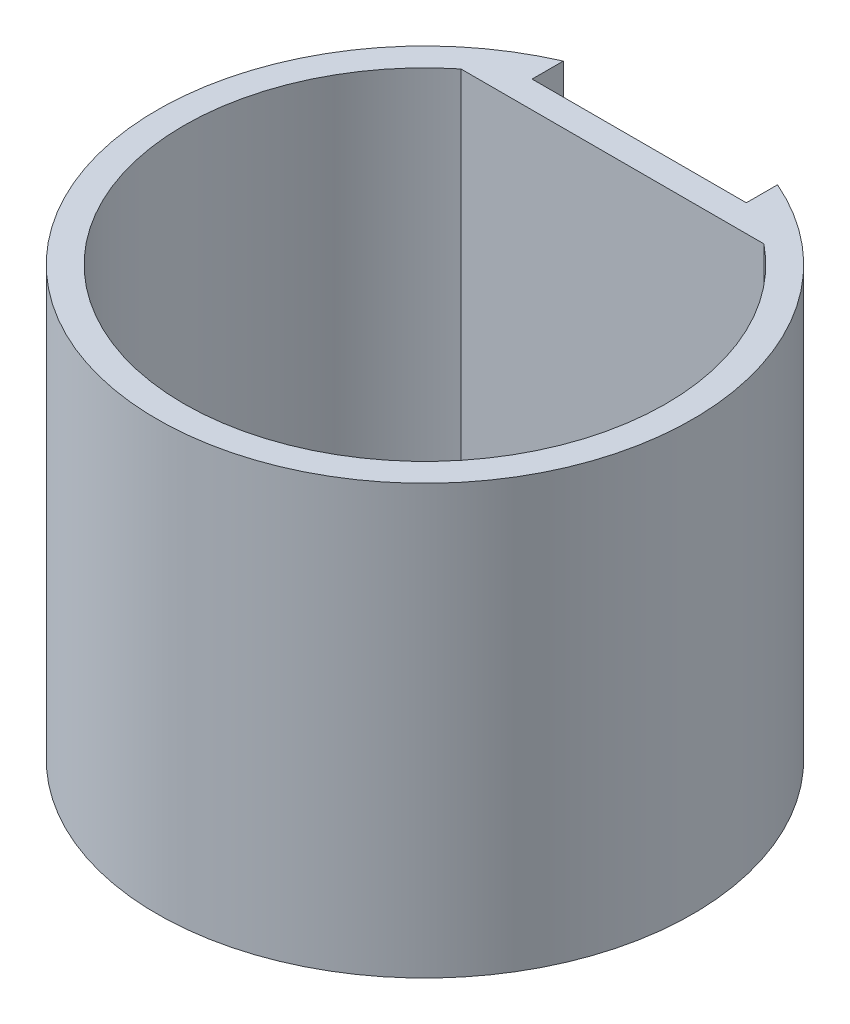
ISO-10303-21;
HEADER;
FILE_DESCRIPTION(('STEP AP214'),'2;1');
FILE_NAME('part.step','',(''),(''),'','','');
FILE_SCHEMA(('AUTOMOTIVE_DESIGN { 1 0 10303 214 1 1 1 1 }'));
ENDSEC;
DATA;
#1=APPLICATION_CONTEXT('core data for automotive mechanical design processes');
#2=APPLICATION_PROTOCOL_DEFINITION('international standard','automotive_design',2000,#1);
#3=PRODUCT_CONTEXT('',#1,'mechanical');
#4=PRODUCT('Part','Part','',(#3));
#5=PRODUCT_RELATED_PRODUCT_CATEGORY('part','',(#4));
#6=PRODUCT_DEFINITION_FORMATION('','',#4);
#7=PRODUCT_DEFINITION_CONTEXT('part definition',#1,'design');
#8=PRODUCT_DEFINITION('design','',#6,#7);
#9=PRODUCT_DEFINITION_SHAPE('','',#8);
#10=(LENGTH_UNIT() NAMED_UNIT(*) SI_UNIT(.MILLI.,.METRE.));
#11=(NAMED_UNIT(*) PLANE_ANGLE_UNIT() SI_UNIT($,.RADIAN.));
#12=(NAMED_UNIT(*) SI_UNIT($,.STERADIAN.) SOLID_ANGLE_UNIT());
#13=UNCERTAINTY_MEASURE_WITH_UNIT(LENGTH_MEASURE(1.E-05),#10,'distance_accuracy_value','');
#14=(GEOMETRIC_REPRESENTATION_CONTEXT(3) GLOBAL_UNCERTAINTY_ASSIGNED_CONTEXT((#13)) GLOBAL_UNIT_ASSIGNED_CONTEXT((#10,
#11,#12)) REPRESENTATION_CONTEXT('',''));
#15=CARTESIAN_POINT('',(0.,0.,0.));
#16=DIRECTION('',(0.,0.,1.));
#17=DIRECTION('',(1.,0.,0.));
#18=AXIS2_PLACEMENT_3D('',#15,#16,#17);
#19=CARTESIAN_POINT('',(0.,0.,0.));
#20=DIRECTION('',(0.,1.,0.));
#21=DIRECTION('',(0.,0.,1.));
#22=AXIS2_PLACEMENT_3D('',#19,#20,#21);
#23=PLANE('',#22);
#24=CARTESIAN_POINT('',(0.,0.,0.));
#25=DIRECTION('',(0.,1.,0.));
#26=DIRECTION('',(0.,0.,1.));
#27=AXIS2_PLACEMENT_3D('',#24,#25,#26);
#28=CIRCLE('',#27,100.);
#29=CARTESIAN_POINT('',(-40.,0.,-91.6515138991168));
#30=VERTEX_POINT('',#29);
#31=CARTESIAN_POINT('',(40.,0.,-91.6515138991168));
#32=VERTEX_POINT('',#31);
#33=EDGE_CURVE('E126',#30,#32,#28,.T.);
#34=ORIENTED_EDGE('',*,*,#33,.T.);
#35=DIRECTION('',(0.,0.,-1.));
#36=VECTOR('',#35,1.);
#37=CARTESIAN_POINT('',(40.,0.,-80.));
#38=LINE('',#37,#36);
#39=CARTESIAN_POINT('',(40.,0.,-80.));
#40=VERTEX_POINT('',#39);
#41=EDGE_CURVE('E143',#40,#32,#38,.T.);
#42=ORIENTED_EDGE('',*,*,#41,.F.);
#43=DIRECTION('',(1.,0.,0.));
#44=VECTOR('',#43,1.);
#45=CARTESIAN_POINT('',(-40.,0.,-80.));
#46=LINE('',#45,#44);
#47=CARTESIAN_POINT('',(-40.,0.,-80.));
#48=VERTEX_POINT('',#47);
#49=EDGE_CURVE('E147',#48,#40,#46,.T.);
#50=ORIENTED_EDGE('',*,*,#49,.F.);
#51=DIRECTION('',(0.,0.,1.));
#52=VECTOR('',#51,1.);
#53=CARTESIAN_POINT('',(-40.,0.,-91.6515138991168));
#54=LINE('',#53,#52);
#55=EDGE_CURVE('E131',#30,#48,#54,.T.);
#56=ORIENTED_EDGE('',*,*,#55,.F.);
#57=EDGE_LOOP('',(#34,#42,#50,#56));
#58=FACE_BOUND('',#57,.T.);
#59=CARTESIAN_POINT('',(0.,0.,0.));
#60=DIRECTION('',(0.,1.,0.));
#61=DIRECTION('',(0.,0.,1.));
#62=AXIS2_PLACEMENT_3D('',#59,#60,#61);
#63=CIRCLE('',#62,90.);
#64=CARTESIAN_POINT('',(-56.5685424949238,0.,-70.));
#65=VERTEX_POINT('',#64);
#66=CARTESIAN_POINT('',(56.5685424949238,0.,-70.));
#67=VERTEX_POINT('',#66);
#68=EDGE_CURVE('E115',#65,#67,#63,.T.);
#69=ORIENTED_EDGE('',*,*,#68,.F.);
#70=DIRECTION('',(1.,0.,0.));
#71=VECTOR('',#70,1.);
#72=CARTESIAN_POINT('',(0.,0.,-70.));
#73=LINE('',#72,#71);
#74=EDGE_CURVE('E57',#65,#67,#73,.T.);
#75=ORIENTED_EDGE('',*,*,#74,.T.);
#76=EDGE_LOOP('',(#69,#75));
#77=FACE_BOUND('',#76,.T.);
#78=ADVANCED_FACE('F39',(#58,#77),#23,.T.);
#79=CARTESIAN_POINT('',(0.,-160.,0.));
#80=DIRECTION('',(0.,1.,0.));
#81=DIRECTION('',(0.,0.,1.));
#82=AXIS2_PLACEMENT_3D('',#79,#80,#81);
#83=CYLINDRICAL_SURFACE('',#82,100.);
#84=ORIENTED_EDGE('',*,*,#33,.F.);
#85=DIRECTION('',(0.,1.,0.));
#86=VECTOR('',#85,1.);
#87=CARTESIAN_POINT('',(-40.,-160.,-91.6515138991168));
#88=LINE('',#87,#86);
#89=CARTESIAN_POINT('',(-40.,-160.,-91.6515138991168));
#90=VERTEX_POINT('',#89);
#91=EDGE_CURVE('E11',#90,#30,#88,.T.);
#92=ORIENTED_EDGE('',*,*,#91,.F.);
#93=CARTESIAN_POINT('',(0.,-160.,0.));
#94=DIRECTION('',(0.,1.,0.));
#95=DIRECTION('',(0.,0.,1.));
#96=AXIS2_PLACEMENT_3D('',#93,#94,#95);
#97=CIRCLE('',#96,100.);
#98=CARTESIAN_POINT('',(40.,-160.,-91.6515138991168));
#99=VERTEX_POINT('',#98);
#100=EDGE_CURVE('E128',#90,#99,#97,.T.);
#101=ORIENTED_EDGE('',*,*,#100,.T.);
#102=DIRECTION('',(0.,1.,0.));
#103=VECTOR('',#102,1.);
#104=CARTESIAN_POINT('',(40.,-160.,-91.6515138991168));
#105=LINE('',#104,#103);
#106=EDGE_CURVE('E43',#99,#32,#105,.T.);
#107=ORIENTED_EDGE('',*,*,#106,.T.);
#108=EDGE_LOOP('',(#84,#92,#101,#107));
#109=FACE_BOUND('',#108,.T.);
#110=ADVANCED_FACE('F41',(#109),#83,.T.);
#111=CARTESIAN_POINT('',(-40.,-160.,-91.6515138991168));
#112=DIRECTION('',(-1.,0.,0.));
#113=DIRECTION('',(0.,0.,1.));
#114=AXIS2_PLACEMENT_3D('',#111,#112,#113);
#115=PLANE('',#114);
#116=ORIENTED_EDGE('',*,*,#55,.T.);
#117=DIRECTION('',(0.,1.,0.));
#118=VECTOR('',#117,1.);
#119=CARTESIAN_POINT('',(-40.,-160.,-80.));
#120=LINE('',#119,#118);
#121=CARTESIAN_POINT('',(-40.,-160.,-80.));
#122=VERTEX_POINT('',#121);
#123=EDGE_CURVE('E49',#122,#48,#120,.T.);
#124=ORIENTED_EDGE('',*,*,#123,.F.);
#125=DIRECTION('',(0.,0.,1.));
#126=VECTOR('',#125,1.);
#127=CARTESIAN_POINT('',(-40.,-160.,-91.6515138991168));
#128=LINE('',#127,#126);
#129=EDGE_CURVE('E137',#90,#122,#128,.T.);
#130=ORIENTED_EDGE('',*,*,#129,.F.);
#131=ORIENTED_EDGE('',*,*,#91,.T.);
#132=EDGE_LOOP('',(#116,#124,#130,#131));
#133=FACE_BOUND('',#132,.T.);
#134=ADVANCED_FACE('F166',(#133),#115,.F.);
#135=CARTESIAN_POINT('',(-40.,-160.,-80.));
#136=DIRECTION('',(0.,0.,1.));
#137=DIRECTION('',(1.,0.,0.));
#138=AXIS2_PLACEMENT_3D('',#135,#136,#137);
#139=PLANE('',#138);
#140=ORIENTED_EDGE('',*,*,#49,.T.);
#141=DIRECTION('',(0.,1.,0.));
#142=VECTOR('',#141,1.);
#143=CARTESIAN_POINT('',(40.,-160.,-80.));
#144=LINE('',#143,#142);
#145=CARTESIAN_POINT('',(40.,-160.,-80.));
#146=VERTEX_POINT('',#145);
#147=EDGE_CURVE('E154',#146,#40,#144,.T.);
#148=ORIENTED_EDGE('',*,*,#147,.F.);
#149=DIRECTION('',(1.,0.,0.));
#150=VECTOR('',#149,1.);
#151=CARTESIAN_POINT('',(-40.,-160.,-80.));
#152=LINE('',#151,#150);
#153=EDGE_CURVE('E134',#122,#146,#152,.T.);
#154=ORIENTED_EDGE('',*,*,#153,.F.);
#155=ORIENTED_EDGE('',*,*,#123,.T.);
#156=EDGE_LOOP('',(#140,#148,#154,#155));
#157=FACE_BOUND('',#156,.T.);
#158=ADVANCED_FACE('F169',(#157),#139,.F.);
#159=CARTESIAN_POINT('',(40.,-160.,-80.));
#160=DIRECTION('',(1.,0.,0.));
#161=DIRECTION('',(0.,0.,-1.));
#162=AXIS2_PLACEMENT_3D('',#159,#160,#161);
#163=PLANE('',#162);
#164=ORIENTED_EDGE('',*,*,#41,.T.);
#165=ORIENTED_EDGE('',*,*,#106,.F.);
#166=DIRECTION('',(0.,0.,-1.));
#167=VECTOR('',#166,1.);
#168=CARTESIAN_POINT('',(40.,-160.,-80.));
#169=LINE('',#168,#167);
#170=EDGE_CURVE('E90',#146,#99,#169,.T.);
#171=ORIENTED_EDGE('',*,*,#170,.F.);
#172=ORIENTED_EDGE('',*,*,#147,.T.);
#173=EDGE_LOOP('',(#164,#165,#171,#172));
#174=FACE_BOUND('',#173,.T.);
#175=ADVANCED_FACE('F161',(#174),#163,.F.);
#176=CARTESIAN_POINT('',(0.,-160.,0.));
#177=DIRECTION('',(0.,1.,0.));
#178=DIRECTION('',(0.,0.,1.));
#179=AXIS2_PLACEMENT_3D('',#176,#177,#178);
#180=PLANE('',#179);
#181=ORIENTED_EDGE('',*,*,#100,.F.);
#182=ORIENTED_EDGE('',*,*,#129,.T.);
#183=ORIENTED_EDGE('',*,*,#153,.T.);
#184=ORIENTED_EDGE('',*,*,#170,.T.);
#185=EDGE_LOOP('',(#181,#182,#183,#184));
#186=FACE_BOUND('',#185,.T.);
#187=ADVANCED_FACE('F170',(#186),#180,.F.);
#188=CARTESIAN_POINT('',(0.,-150.,-70.));
#189=DIRECTION('',(0.,0.,1.));
#190=DIRECTION('',(1.,0.,0.));
#191=AXIS2_PLACEMENT_3D('',#188,#189,#190);
#192=PLANE('',#191);
#193=ORIENTED_EDGE('',*,*,#74,.F.);
#194=DIRECTION('',(0.,1.,0.));
#195=VECTOR('',#194,1.);
#196=CARTESIAN_POINT('',(-56.5685424949238,-150.,-70.));
#197=LINE('',#196,#195);
#198=CARTESIAN_POINT('',(-56.5685424949238,-150.,-70.));
#199=VERTEX_POINT('',#198);
#200=EDGE_CURVE('E98',#199,#65,#197,.T.);
#201=ORIENTED_EDGE('',*,*,#200,.F.);
#202=DIRECTION('',(1.,0.,0.));
#203=VECTOR('',#202,1.);
#204=CARTESIAN_POINT('',(0.,-150.,-70.));
#205=LINE('',#204,#203);
#206=CARTESIAN_POINT('',(56.5685424949238,-150.,-70.));
#207=VERTEX_POINT('',#206);
#208=EDGE_CURVE('E101',#199,#207,#205,.T.);
#209=ORIENTED_EDGE('',*,*,#208,.T.);
#210=DIRECTION('',(0.,1.,0.));
#211=VECTOR('',#210,1.);
#212=CARTESIAN_POINT('',(56.5685424949238,-150.,-70.));
#213=LINE('',#212,#211);
#214=EDGE_CURVE('E108',#207,#67,#213,.T.);
#215=ORIENTED_EDGE('',*,*,#214,.T.);
#216=EDGE_LOOP('',(#193,#201,#209,#215));
#217=FACE_BOUND('',#216,.T.);
#218=ADVANCED_FACE('F100',(#217),#192,.T.);
#219=CARTESIAN_POINT('',(0.,-150.,0.));
#220=DIRECTION('',(0.,1.,0.));
#221=DIRECTION('',(0.,0.,1.));
#222=AXIS2_PLACEMENT_3D('',#219,#220,#221);
#223=CYLINDRICAL_SURFACE('',#222,90.);
#224=ORIENTED_EDGE('',*,*,#68,.T.);
#225=ORIENTED_EDGE('',*,*,#214,.F.);
#226=CARTESIAN_POINT('',(0.,-150.,0.));
#227=DIRECTION('',(0.,1.,0.));
#228=DIRECTION('',(0.,0.,1.));
#229=AXIS2_PLACEMENT_3D('',#226,#227,#228);
#230=CIRCLE('',#229,90.);
#231=EDGE_CURVE('E109',#199,#207,#230,.T.);
#232=ORIENTED_EDGE('',*,*,#231,.F.);
#233=ORIENTED_EDGE('',*,*,#200,.T.);
#234=EDGE_LOOP('',(#224,#225,#232,#233));
#235=FACE_BOUND('',#234,.T.);
#236=ADVANCED_FACE('F117',(#235),#223,.F.);
#237=CARTESIAN_POINT('',(0.,-150.,0.));
#238=DIRECTION('',(0.,1.,0.));
#239=DIRECTION('',(0.,0.,1.));
#240=AXIS2_PLACEMENT_3D('',#237,#238,#239);
#241=PLANE('',#240);
#242=ORIENTED_EDGE('',*,*,#208,.F.);
#243=ORIENTED_EDGE('',*,*,#231,.T.);
#244=EDGE_LOOP('',(#242,#243));
#245=FACE_BOUND('',#244,.T.);
#246=ADVANCED_FACE('F113',(#245),#241,.T.);
#247=CLOSED_SHELL('',(#78,#110,#134,#158,#175,#187,#218,#236,#246));
#248=MANIFOLD_SOLID_BREP('B2',#247);
#249=ADVANCED_BREP_SHAPE_REPRESENTATION('',(#18,#248),#14);
#250=SHAPE_DEFINITION_REPRESENTATION(#9,#249);
ENDSEC;
END-ISO-10303-21;
